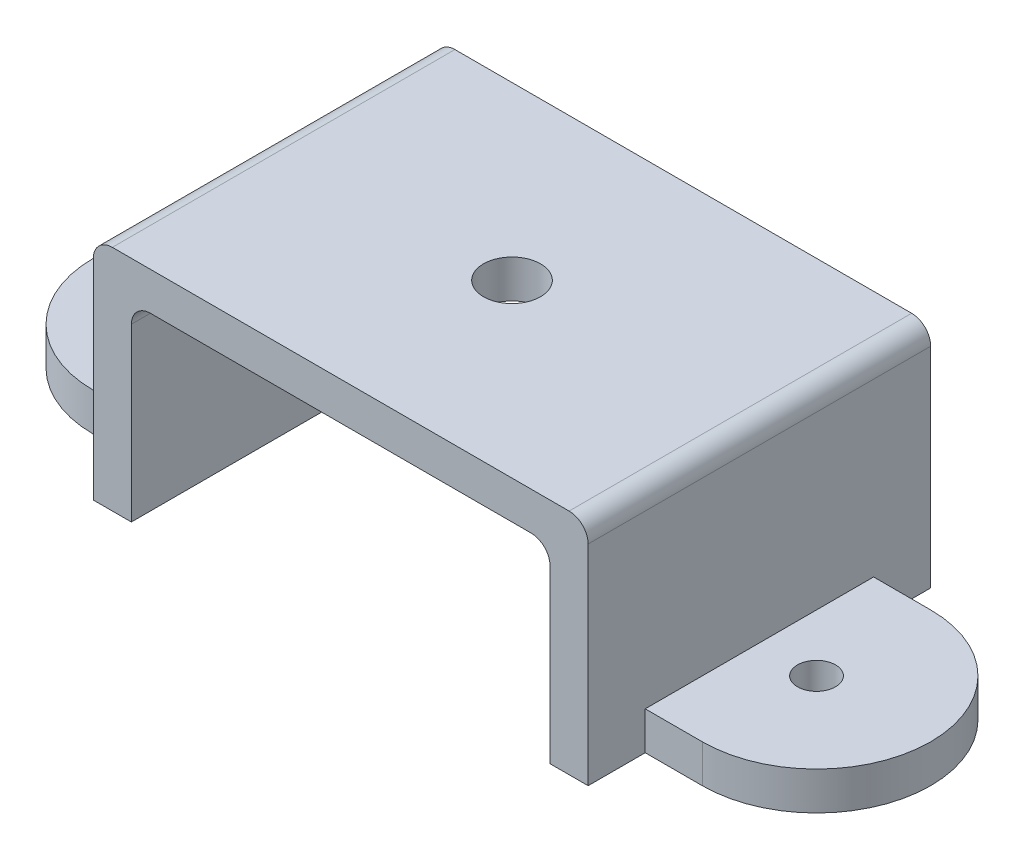
ISO-10303-21;
HEADER;
FILE_DESCRIPTION(('STEP AP214'),'2;1');
FILE_NAME('part.step','',(''),(''),'','','');
FILE_SCHEMA(('AUTOMOTIVE_DESIGN { 1 0 10303 214 1 1 1 1 }'));
ENDSEC;
DATA;
#1=APPLICATION_CONTEXT('core data for automotive mechanical design processes');
#2=APPLICATION_PROTOCOL_DEFINITION('international standard','automotive_design',2000,#1);
#3=PRODUCT_CONTEXT('',#1,'mechanical');
#4=PRODUCT('Part','Part','',(#3));
#5=PRODUCT_RELATED_PRODUCT_CATEGORY('part','',(#4));
#6=PRODUCT_DEFINITION_FORMATION('','',#4);
#7=PRODUCT_DEFINITION_CONTEXT('part definition',#1,'design');
#8=PRODUCT_DEFINITION('design','',#6,#7);
#9=PRODUCT_DEFINITION_SHAPE('','',#8);
#10=(LENGTH_UNIT() NAMED_UNIT(*) SI_UNIT(.MILLI.,.METRE.));
#11=(NAMED_UNIT(*) PLANE_ANGLE_UNIT() SI_UNIT($,.RADIAN.));
#12=(NAMED_UNIT(*) SI_UNIT($,.STERADIAN.) SOLID_ANGLE_UNIT());
#13=UNCERTAINTY_MEASURE_WITH_UNIT(LENGTH_MEASURE(1.E-05),#10,'distance_accuracy_value','');
#14=(GEOMETRIC_REPRESENTATION_CONTEXT(3) GLOBAL_UNCERTAINTY_ASSIGNED_CONTEXT((#13)) GLOBAL_UNIT_ASSIGNED_CONTEXT((#10,
#11,#12)) REPRESENTATION_CONTEXT('',''));
#15=CARTESIAN_POINT('',(0.,0.,0.));
#16=DIRECTION('',(0.,0.,1.));
#17=DIRECTION('',(1.,0.,0.));
#18=AXIS2_PLACEMENT_3D('',#15,#16,#17);
#19=CARTESIAN_POINT('',(0.,0.,0.));
#20=DIRECTION('',(0.,1.,0.));
#21=DIRECTION('',(0.,0.,1.));
#22=AXIS2_PLACEMENT_3D('',#19,#20,#21);
#23=PLANE('',#22);
#24=CARTESIAN_POINT('',(-101.6,0.,0.));
#25=DIRECTION('',(0.,1.,0.));
#26=DIRECTION('',(0.,0.,1.));
#27=AXIS2_PLACEMENT_3D('',#24,#25,#26);
#28=CIRCLE('',#27,6.35);
#29=CARTESIAN_POINT('',(-101.6,0.,6.35));
#30=VERTEX_POINT('',#29);
#31=EDGE_CURVE('E671',#30,#30,#28,.T.);
#32=ORIENTED_EDGE('',*,*,#31,.T.);
#33=EDGE_LOOP('',(#32));
#34=FACE_BOUND('',#33,.T.);
#35=DIRECTION('',(1.,0.,0.));
#36=VECTOR('',#35,1.);
#37=CARTESIAN_POINT('',(0.,0.,-57.15));
#38=LINE('',#37,#36);
#39=CARTESIAN_POINT('',(-82.55,0.,-57.15));
#40=VERTEX_POINT('',#39);
#41=CARTESIAN_POINT('',(-69.85,0.,-57.15));
#42=VERTEX_POINT('',#41);
#43=EDGE_CURVE('E231',#40,#42,#38,.T.);
#44=ORIENTED_EDGE('',*,*,#43,.T.);
#45=DIRECTION('',(0.,0.,1.));
#46=VECTOR('',#45,1.);
#47=CARTESIAN_POINT('',(-69.85,0.,-57.15));
#48=LINE('',#47,#46);
#49=CARTESIAN_POINT('',(-69.85,0.,57.15));
#50=VERTEX_POINT('',#49);
#51=EDGE_CURVE('E239',#42,#50,#48,.T.);
#52=ORIENTED_EDGE('',*,*,#51,.T.);
#53=DIRECTION('',(1.,0.,0.));
#54=VECTOR('',#53,1.);
#55=CARTESIAN_POINT('',(0.,0.,57.15));
#56=LINE('',#55,#54);
#57=CARTESIAN_POINT('',(-82.55,0.,57.15));
#58=VERTEX_POINT('',#57);
#59=EDGE_CURVE('E213',#58,#50,#56,.T.);
#60=ORIENTED_EDGE('',*,*,#59,.F.);
#61=DIRECTION('',(0.,0.,1.));
#62=VECTOR('',#61,1.);
#63=CARTESIAN_POINT('',(-82.55,0.,-57.15));
#64=LINE('',#63,#62);
#65=CARTESIAN_POINT('',(-82.55,0.,38.1));
#66=VERTEX_POINT('',#65);
#67=EDGE_CURVE('E244',#66,#58,#64,.T.);
#68=ORIENTED_EDGE('',*,*,#67,.F.);
#69=DIRECTION('',(1.,0.,0.));
#70=VECTOR('',#69,1.);
#71=CARTESIAN_POINT('',(0.,0.,38.0999999999999));
#72=LINE('',#71,#70);
#73=CARTESIAN_POINT('',(-101.6,0.,38.1));
#74=VERTEX_POINT('',#73);
#75=EDGE_CURVE('E278',#74,#66,#72,.T.);
#76=ORIENTED_EDGE('',*,*,#75,.F.);
#77=CARTESIAN_POINT('',(-101.6,0.,0.));
#78=DIRECTION('',(0.,1.,0.));
#79=DIRECTION('',(0.,0.,1.));
#80=AXIS2_PLACEMENT_3D('',#77,#78,#79);
#81=CIRCLE('',#80,38.1);
#82=CARTESIAN_POINT('',(-101.6,0.,-38.1));
#83=VERTEX_POINT('',#82);
#84=EDGE_CURVE('E288',#83,#74,#81,.T.);
#85=ORIENTED_EDGE('',*,*,#84,.F.);
#86=DIRECTION('',(1.,0.,0.));
#87=VECTOR('',#86,1.);
#88=CARTESIAN_POINT('',(0.,0.,-38.1));
#89=LINE('',#88,#87);
#90=CARTESIAN_POINT('',(-82.55,0.,-38.1));
#91=VERTEX_POINT('',#90);
#92=EDGE_CURVE('E285',#83,#91,#89,.T.);
#93=ORIENTED_EDGE('',*,*,#92,.T.);
#94=EDGE_CURVE('E242',#40,#91,#64,.T.);
#95=ORIENTED_EDGE('',*,*,#94,.F.);
#96=EDGE_LOOP('',(#44,#52,#60,#68,#76,#85,#93,#95));
#97=FACE_BOUND('',#96,.T.);
#98=ADVANCED_FACE('F35',(#34,#97),#23,.F.);
#99=CARTESIAN_POINT('',(101.6,0.,0.));
#100=DIRECTION('',(0.,1.,0.));
#101=DIRECTION('',(0.,0.,1.));
#102=AXIS2_PLACEMENT_3D('',#99,#100,#101);
#103=CIRCLE('',#102,6.35);
#104=CARTESIAN_POINT('',(101.6,0.,6.35));
#105=VERTEX_POINT('',#104);
#106=EDGE_CURVE('E663',#105,#105,#103,.T.);
#107=ORIENTED_EDGE('',*,*,#106,.T.);
#108=EDGE_LOOP('',(#107));
#109=FACE_BOUND('',#108,.T.);
#110=DIRECTION('',(0.,0.,1.));
#111=VECTOR('',#110,1.);
#112=CARTESIAN_POINT('',(69.85,0.,-57.15));
#113=LINE('',#112,#111);
#114=CARTESIAN_POINT('',(69.85,0.,-57.15));
#115=VERTEX_POINT('',#114);
#116=CARTESIAN_POINT('',(69.85,0.,57.15));
#117=VERTEX_POINT('',#116);
#118=EDGE_CURVE('E175',#115,#117,#113,.T.);
#119=ORIENTED_EDGE('',*,*,#118,.F.);
#120=DIRECTION('',(1.,0.,0.));
#121=VECTOR('',#120,1.);
#122=CARTESIAN_POINT('',(0.,0.,-57.15));
#123=LINE('',#122,#121);
#124=CARTESIAN_POINT('',(82.55,0.,-57.15));
#125=VERTEX_POINT('',#124);
#126=EDGE_CURVE('E222',#115,#125,#123,.T.);
#127=ORIENTED_EDGE('',*,*,#126,.T.);
#128=DIRECTION('',(0.,0.,1.));
#129=VECTOR('',#128,1.);
#130=CARTESIAN_POINT('',(82.55,0.,-57.15));
#131=LINE('',#130,#129);
#132=CARTESIAN_POINT('',(82.55,0.,-38.1));
#133=VERTEX_POINT('',#132);
#134=EDGE_CURVE('E245',#125,#133,#131,.T.);
#135=ORIENTED_EDGE('',*,*,#134,.T.);
#136=CARTESIAN_POINT('',(101.6,0.,-38.1));
#137=VERTEX_POINT('',#136);
#138=EDGE_CURVE('E284',#133,#137,#89,.T.);
#139=ORIENTED_EDGE('',*,*,#138,.T.);
#140=CARTESIAN_POINT('',(101.6,0.,0.));
#141=DIRECTION('',(0.,1.,0.));
#142=DIRECTION('',(0.,0.,1.));
#143=AXIS2_PLACEMENT_3D('',#140,#141,#142);
#144=CIRCLE('',#143,38.1);
#145=CARTESIAN_POINT('',(101.6,0.,38.0999999999999));
#146=VERTEX_POINT('',#145);
#147=EDGE_CURVE('E281',#146,#137,#144,.T.);
#148=ORIENTED_EDGE('',*,*,#147,.F.);
#149=CARTESIAN_POINT('',(82.55,0.,38.0999999999999));
#150=VERTEX_POINT('',#149);
#151=EDGE_CURVE('E263',#150,#146,#72,.T.);
#152=ORIENTED_EDGE('',*,*,#151,.F.);
#153=CARTESIAN_POINT('',(82.55,0.,57.15));
#154=VERTEX_POINT('',#153);
#155=EDGE_CURVE('E186',#150,#154,#131,.T.);
#156=ORIENTED_EDGE('',*,*,#155,.T.);
#157=DIRECTION('',(1.,0.,0.));
#158=VECTOR('',#157,1.);
#159=CARTESIAN_POINT('',(0.,0.,57.15));
#160=LINE('',#159,#158);
#161=EDGE_CURVE('E190',#117,#154,#160,.T.);
#162=ORIENTED_EDGE('',*,*,#161,.F.);
#163=EDGE_LOOP('',(#119,#127,#135,#139,#148,#152,#156,#162));
#164=FACE_BOUND('',#163,.T.);
#165=ADVANCED_FACE('F191',(#109,#164),#23,.F.);
#166=CARTESIAN_POINT('',(0.,63.5,-57.15));
#167=DIRECTION('',(0.,-1.,0.));
#168=DIRECTION('',(0.,0.,-1.));
#169=AXIS2_PLACEMENT_3D('',#166,#167,#168);
#170=PLANE('',#169);
#171=DIRECTION('',(1.,0.,0.));
#172=VECTOR('',#171,1.);
#173=CARTESIAN_POINT('',(0.,63.5,57.15));
#174=LINE('',#173,#172);
#175=CARTESIAN_POINT('',(-63.5,63.5,57.15));
#176=VERTEX_POINT('',#175);
#177=CARTESIAN_POINT('',(63.5,63.5,57.15));
#178=VERTEX_POINT('',#177);
#179=EDGE_CURVE('E219',#176,#178,#174,.T.);
#180=ORIENTED_EDGE('',*,*,#179,.F.);
#181=DIRECTION('',(0.,0.,1.));
#182=VECTOR('',#181,1.);
#183=CARTESIAN_POINT('',(-63.5,63.5,-57.15));
#184=LINE('',#183,#182);
#185=CARTESIAN_POINT('',(-63.5,63.5,-57.15));
#186=VERTEX_POINT('',#185);
#187=EDGE_CURVE('E306',#176,#186,#184,.F.);
#188=ORIENTED_EDGE('',*,*,#187,.T.);
#189=DIRECTION('',(1.,0.,0.));
#190=VECTOR('',#189,1.);
#191=CARTESIAN_POINT('',(0.,63.5,-57.15));
#192=LINE('',#191,#190);
#193=CARTESIAN_POINT('',(63.5,63.5,-57.15));
#194=VERTEX_POINT('',#193);
#195=EDGE_CURVE('E187',#186,#194,#192,.T.);
#196=ORIENTED_EDGE('',*,*,#195,.T.);
#197=DIRECTION('',(0.,0.,1.));
#198=VECTOR('',#197,1.);
#199=CARTESIAN_POINT('',(63.5,63.5,-57.15));
#200=LINE('',#199,#198);
#201=EDGE_CURVE('E303',#194,#178,#200,.T.);
#202=ORIENTED_EDGE('',*,*,#201,.T.);
#203=EDGE_LOOP('',(#180,#188,#196,#202));
#204=FACE_BOUND('',#203,.T.);
#205=CARTESIAN_POINT('',(0.,63.5,0.));
#206=DIRECTION('',(0.,-1.,0.));
#207=DIRECTION('',(0.,0.,-1.));
#208=AXIS2_PLACEMENT_3D('',#205,#206,#207);
#209=CIRCLE('',#208,9.525);
#210=CARTESIAN_POINT('',(0.,63.5,-9.525));
#211=VERTEX_POINT('',#210);
#212=EDGE_CURVE('E201',#211,#211,#209,.F.);
#213=ORIENTED_EDGE('',*,*,#212,.T.);
#214=EDGE_LOOP('',(#213));
#215=FACE_BOUND('',#214,.T.);
#216=ADVANCED_FACE('F344',(#204,#215),#170,.T.);
#217=CARTESIAN_POINT('',(0.,76.2,-57.15));
#218=DIRECTION('',(0.,-1.,0.));
#219=DIRECTION('',(0.,0.,-1.));
#220=AXIS2_PLACEMENT_3D('',#217,#218,#219);
#221=PLANE('',#220);
#222=DIRECTION('',(1.,0.,0.));
#223=VECTOR('',#222,1.);
#224=CARTESIAN_POINT('',(0.,76.2,57.15));
#225=LINE('',#224,#223);
#226=CARTESIAN_POINT('',(-76.2,76.2,57.15));
#227=VERTEX_POINT('',#226);
#228=CARTESIAN_POINT('',(76.2,76.2,57.15));
#229=VERTEX_POINT('',#228);
#230=EDGE_CURVE('E209',#227,#229,#225,.T.);
#231=ORIENTED_EDGE('',*,*,#230,.T.);
#232=DIRECTION('',(0.,0.,1.));
#233=VECTOR('',#232,1.);
#234=CARTESIAN_POINT('',(76.2,76.2,-57.15));
#235=LINE('',#234,#233);
#236=CARTESIAN_POINT('',(76.2,76.2,-57.15));
#237=VERTEX_POINT('',#236);
#238=EDGE_CURVE('E58',#229,#237,#235,.F.);
#239=ORIENTED_EDGE('',*,*,#238,.T.);
#240=DIRECTION('',(1.,0.,0.));
#241=VECTOR('',#240,1.);
#242=CARTESIAN_POINT('',(0.,76.2,-57.15));
#243=LINE('',#242,#241);
#244=CARTESIAN_POINT('',(-76.2,76.2,-57.15));
#245=VERTEX_POINT('',#244);
#246=EDGE_CURVE('E227',#245,#237,#243,.T.);
#247=ORIENTED_EDGE('',*,*,#246,.F.);
#248=DIRECTION('',(0.,0.,1.));
#249=VECTOR('',#248,1.);
#250=CARTESIAN_POINT('',(-76.2,76.2,-57.15));
#251=LINE('',#250,#249);
#252=EDGE_CURVE('E317',#245,#227,#251,.T.);
#253=ORIENTED_EDGE('',*,*,#252,.T.);
#254=EDGE_LOOP('',(#231,#239,#247,#253));
#255=FACE_BOUND('',#254,.T.);
#256=CARTESIAN_POINT('',(0.,76.2,0.));
#257=DIRECTION('',(0.,1.,0.));
#258=DIRECTION('',(0.,0.,1.));
#259=AXIS2_PLACEMENT_3D('',#256,#257,#258);
#260=CIRCLE('',#259,9.525);
#261=CARTESIAN_POINT('',(0.,76.2,-9.525));
#262=VERTEX_POINT('',#261);
#263=EDGE_CURVE('E204',#262,#262,#260,.T.);
#264=ORIENTED_EDGE('',*,*,#263,.F.);
#265=EDGE_LOOP('',(#264));
#266=FACE_BOUND('',#265,.T.);
#267=ADVANCED_FACE('F367',(#255,#266),#221,.F.);
#268=CARTESIAN_POINT('',(0.,12.7,38.0999999999999));
#269=DIRECTION('',(0.,0.,-1.));
#270=DIRECTION('',(-1.,0.,0.));
#271=AXIS2_PLACEMENT_3D('',#268,#269,#270);
#272=PLANE('',#271);
#273=DIRECTION('',(0.,-1.,0.));
#274=VECTOR('',#273,1.);
#275=CARTESIAN_POINT('',(-82.55,12.7,38.1));
#276=LINE('',#275,#274);
#277=CARTESIAN_POINT('',(-82.55,12.7,38.1));
#278=VERTEX_POINT('',#277);
#279=EDGE_CURVE('E261',#278,#66,#276,.T.);
#280=ORIENTED_EDGE('',*,*,#279,.F.);
#281=DIRECTION('',(1.,0.,0.));
#282=VECTOR('',#281,1.);
#283=CARTESIAN_POINT('',(0.,12.7,38.0999999999999));
#284=LINE('',#283,#282);
#285=CARTESIAN_POINT('',(-101.6,12.7,38.1));
#286=VERTEX_POINT('',#285);
#287=EDGE_CURVE('E264',#286,#278,#284,.T.);
#288=ORIENTED_EDGE('',*,*,#287,.F.);
#289=DIRECTION('',(0.,-1.,0.));
#290=VECTOR('',#289,1.);
#291=CARTESIAN_POINT('',(-101.6,12.7,38.1));
#292=LINE('',#291,#290);
#293=EDGE_CURVE('E277',#286,#74,#292,.T.);
#294=ORIENTED_EDGE('',*,*,#293,.T.);
#295=ORIENTED_EDGE('',*,*,#75,.T.);
#296=EDGE_LOOP('',(#280,#288,#294,#295));
#297=FACE_BOUND('',#296,.T.);
#298=ADVANCED_FACE('F392',(#297),#272,.F.);
#299=CARTESIAN_POINT('',(0.,12.7,-38.1));
#300=DIRECTION('',(0.,0.,-1.));
#301=DIRECTION('',(-1.,0.,0.));
#302=AXIS2_PLACEMENT_3D('',#299,#300,#301);
#303=PLANE('',#302);
#304=DIRECTION('',(1.,0.,0.));
#305=VECTOR('',#304,1.);
#306=CARTESIAN_POINT('',(0.,12.7,-38.1));
#307=LINE('',#306,#305);
#308=CARTESIAN_POINT('',(-101.6,12.7,-38.1));
#309=VERTEX_POINT('',#308);
#310=CARTESIAN_POINT('',(-82.55,12.7,-38.1));
#311=VERTEX_POINT('',#310);
#312=EDGE_CURVE('E272',#309,#311,#307,.T.);
#313=ORIENTED_EDGE('',*,*,#312,.T.);
#314=DIRECTION('',(0.,-1.,0.));
#315=VECTOR('',#314,1.);
#316=CARTESIAN_POINT('',(-82.55,12.7,-38.1));
#317=LINE('',#316,#315);
#318=EDGE_CURVE('E258',#311,#91,#317,.T.);
#319=ORIENTED_EDGE('',*,*,#318,.T.);
#320=ORIENTED_EDGE('',*,*,#92,.F.);
#321=DIRECTION('',(0.,-1.,0.));
#322=VECTOR('',#321,1.);
#323=CARTESIAN_POINT('',(-101.6,12.7,-38.1));
#324=LINE('',#323,#322);
#325=EDGE_CURVE('E292',#309,#83,#324,.T.);
#326=ORIENTED_EDGE('',*,*,#325,.F.);
#327=EDGE_LOOP('',(#313,#319,#320,#326));
#328=FACE_BOUND('',#327,.T.);
#329=ADVANCED_FACE('F383',(#328),#303,.T.);
#330=CARTESIAN_POINT('',(0.,12.7,0.));
#331=DIRECTION('',(0.,1.,0.));
#332=DIRECTION('',(0.,0.,1.));
#333=AXIS2_PLACEMENT_3D('',#330,#331,#332);
#334=PLANE('',#333);
#335=CARTESIAN_POINT('',(-101.6,12.7,0.));
#336=DIRECTION('',(0.,1.,0.));
#337=DIRECTION('',(0.,0.,1.));
#338=AXIS2_PLACEMENT_3D('',#335,#336,#337);
#339=CIRCLE('',#338,6.35);
#340=CARTESIAN_POINT('',(-101.6,12.7,6.35));
#341=VERTEX_POINT('',#340);
#342=EDGE_CURVE('E668',#341,#341,#339,.T.);
#343=ORIENTED_EDGE('',*,*,#342,.F.);
#344=EDGE_LOOP('',(#343));
#345=FACE_BOUND('',#344,.T.);
#346=ORIENTED_EDGE('',*,*,#287,.T.);
#347=DIRECTION('',(0.,0.,-1.));
#348=VECTOR('',#347,1.);
#349=CARTESIAN_POINT('',(-82.55,12.7,0.));
#350=LINE('',#349,#348);
#351=EDGE_CURVE('E255',#278,#311,#350,.T.);
#352=ORIENTED_EDGE('',*,*,#351,.T.);
#353=ORIENTED_EDGE('',*,*,#312,.F.);
#354=CARTESIAN_POINT('',(-101.6,12.7,0.));
#355=DIRECTION('',(0.,1.,0.));
#356=DIRECTION('',(0.,0.,1.));
#357=AXIS2_PLACEMENT_3D('',#354,#355,#356);
#358=CIRCLE('',#357,38.1);
#359=EDGE_CURVE('E275',#309,#286,#358,.T.);
#360=ORIENTED_EDGE('',*,*,#359,.T.);
#361=EDGE_LOOP('',(#346,#352,#353,#360));
#362=FACE_BOUND('',#361,.T.);
#363=ADVANCED_FACE('F394',(#345,#362),#334,.T.);
#364=CARTESIAN_POINT('',(82.55,12.7,38.0999999999999));
#365=VERTEX_POINT('',#364);
#366=CARTESIAN_POINT('',(101.6,12.7,38.0999999999999));
#367=VERTEX_POINT('',#366);
#368=EDGE_CURVE('E268',#365,#367,#284,.T.);
#369=ORIENTED_EDGE('',*,*,#368,.F.);
#370=DIRECTION('',(0.,-1.,0.));
#371=VECTOR('',#370,1.);
#372=CARTESIAN_POINT('',(82.55,12.7,38.0999999999999));
#373=LINE('',#372,#371);
#374=EDGE_CURVE('E253',#365,#150,#373,.T.);
#375=ORIENTED_EDGE('',*,*,#374,.T.);
#376=ORIENTED_EDGE('',*,*,#151,.T.);
#377=DIRECTION('',(0.,-1.,0.));
#378=VECTOR('',#377,1.);
#379=CARTESIAN_POINT('',(101.6,12.7,38.0999999999999));
#380=LINE('',#379,#378);
#381=EDGE_CURVE('E297',#367,#146,#380,.T.);
#382=ORIENTED_EDGE('',*,*,#381,.F.);
#383=EDGE_LOOP('',(#369,#375,#376,#382));
#384=FACE_BOUND('',#383,.T.);
#385=ADVANCED_FACE('F396',(#384),#272,.F.);
#386=CARTESIAN_POINT('',(101.6,12.7,0.));
#387=DIRECTION('',(0.,-1.,0.));
#388=DIRECTION('',(0.,0.,-1.));
#389=AXIS2_PLACEMENT_3D('',#386,#387,#388);
#390=CYLINDRICAL_SURFACE('',#389,38.1);
#391=ORIENTED_EDGE('',*,*,#147,.T.);
#392=DIRECTION('',(0.,-1.,0.));
#393=VECTOR('',#392,1.);
#394=CARTESIAN_POINT('',(101.6,12.7,-38.1));
#395=LINE('',#394,#393);
#396=CARTESIAN_POINT('',(101.6,12.7,-38.1));
#397=VERTEX_POINT('',#396);
#398=EDGE_CURVE('E294',#397,#137,#395,.T.);
#399=ORIENTED_EDGE('',*,*,#398,.F.);
#400=CARTESIAN_POINT('',(101.6,12.7,0.));
#401=DIRECTION('',(0.,1.,0.));
#402=DIRECTION('',(0.,0.,1.));
#403=AXIS2_PLACEMENT_3D('',#400,#401,#402);
#404=CIRCLE('',#403,38.1);
#405=EDGE_CURVE('E267',#367,#397,#404,.T.);
#406=ORIENTED_EDGE('',*,*,#405,.F.);
#407=ORIENTED_EDGE('',*,*,#381,.T.);
#408=EDGE_LOOP('',(#391,#399,#406,#407));
#409=FACE_BOUND('',#408,.T.);
#410=ADVANCED_FACE('F362',(#409),#390,.T.);
#411=DIRECTION('',(0.,-1.,0.));
#412=VECTOR('',#411,1.);
#413=CARTESIAN_POINT('',(82.55,12.7,-38.1));
#414=LINE('',#413,#412);
#415=CARTESIAN_POINT('',(82.55,12.7,-38.1));
#416=VERTEX_POINT('',#415);
#417=EDGE_CURVE('E250',#416,#133,#414,.T.);
#418=ORIENTED_EDGE('',*,*,#417,.F.);
#419=EDGE_CURVE('E271',#416,#397,#307,.T.);
#420=ORIENTED_EDGE('',*,*,#419,.T.);
#421=ORIENTED_EDGE('',*,*,#398,.T.);
#422=ORIENTED_EDGE('',*,*,#138,.F.);
#423=EDGE_LOOP('',(#418,#420,#421,#422));
#424=FACE_BOUND('',#423,.T.);
#425=ADVANCED_FACE('F358',(#424),#303,.T.);
#426=CARTESIAN_POINT('',(-101.6,12.7,0.));
#427=DIRECTION('',(0.,-1.,0.));
#428=DIRECTION('',(0.,0.,-1.));
#429=AXIS2_PLACEMENT_3D('',#426,#427,#428);
#430=CYLINDRICAL_SURFACE('',#429,38.1);
#431=ORIENTED_EDGE('',*,*,#84,.T.);
#432=ORIENTED_EDGE('',*,*,#293,.F.);
#433=ORIENTED_EDGE('',*,*,#359,.F.);
#434=ORIENTED_EDGE('',*,*,#325,.T.);
#435=EDGE_LOOP('',(#431,#432,#433,#434));
#436=FACE_BOUND('',#435,.T.);
#437=ADVANCED_FACE('F388',(#436),#430,.T.);
#438=CARTESIAN_POINT('',(101.6,12.7,0.));
#439=DIRECTION('',(0.,1.,0.));
#440=DIRECTION('',(0.,0.,1.));
#441=AXIS2_PLACEMENT_3D('',#438,#439,#440);
#442=CIRCLE('',#441,6.35);
#443=CARTESIAN_POINT('',(101.6,12.7,6.35));
#444=VERTEX_POINT('',#443);
#445=EDGE_CURVE('E665',#444,#444,#442,.T.);
#446=ORIENTED_EDGE('',*,*,#445,.F.);
#447=EDGE_LOOP('',(#446));
#448=FACE_BOUND('',#447,.T.);
#449=DIRECTION('',(0.,0.,-1.));
#450=VECTOR('',#449,1.);
#451=CARTESIAN_POINT('',(82.55,12.7,0.));
#452=LINE('',#451,#450);
#453=EDGE_CURVE('E241',#365,#416,#452,.T.);
#454=ORIENTED_EDGE('',*,*,#453,.F.);
#455=ORIENTED_EDGE('',*,*,#368,.T.);
#456=ORIENTED_EDGE('',*,*,#405,.T.);
#457=ORIENTED_EDGE('',*,*,#419,.F.);
#458=EDGE_LOOP('',(#454,#455,#456,#457));
#459=FACE_BOUND('',#458,.T.);
#460=ADVANCED_FACE('F399',(#448,#459),#334,.T.);
#461=CARTESIAN_POINT('',(69.85,0.,-57.15));
#462=DIRECTION('',(1.,0.,0.));
#463=DIRECTION('',(0.,0.,-1.));
#464=AXIS2_PLACEMENT_3D('',#461,#462,#463);
#465=PLANE('',#464);
#466=DIRECTION('',(0.,1.,0.));
#467=VECTOR('',#466,1.);
#468=CARTESIAN_POINT('',(69.85,0.,57.15));
#469=LINE('',#468,#467);
#470=CARTESIAN_POINT('',(69.85,57.15,57.15));
#471=VERTEX_POINT('',#470);
#472=EDGE_CURVE('E179',#117,#471,#469,.T.);
#473=ORIENTED_EDGE('',*,*,#472,.T.);
#474=DIRECTION('',(0.,0.,1.));
#475=VECTOR('',#474,1.);
#476=CARTESIAN_POINT('',(69.85,57.15,-57.15));
#477=LINE('',#476,#475);
#478=CARTESIAN_POINT('',(69.85,57.15,-57.15));
#479=VERTEX_POINT('',#478);
#480=EDGE_CURVE('E308',#471,#479,#477,.F.);
#481=ORIENTED_EDGE('',*,*,#480,.T.);
#482=DIRECTION('',(0.,1.,0.));
#483=VECTOR('',#482,1.);
#484=CARTESIAN_POINT('',(69.85,0.,-57.15));
#485=LINE('',#484,#483);
#486=EDGE_CURVE('E182',#115,#479,#485,.T.);
#487=ORIENTED_EDGE('',*,*,#486,.F.);
#488=ORIENTED_EDGE('',*,*,#118,.T.);
#489=EDGE_LOOP('',(#473,#481,#487,#488));
#490=FACE_BOUND('',#489,.T.);
#491=ADVANCED_FACE('F177',(#490),#465,.F.);
#492=CARTESIAN_POINT('',(-69.85,0.,-57.15));
#493=DIRECTION('',(1.,0.,0.));
#494=DIRECTION('',(0.,0.,-1.));
#495=AXIS2_PLACEMENT_3D('',#492,#493,#494);
#496=PLANE('',#495);
#497=DIRECTION('',(0.,1.,0.));
#498=VECTOR('',#497,1.);
#499=CARTESIAN_POINT('',(-69.85,0.,-57.15));
#500=LINE('',#499,#498);
#501=CARTESIAN_POINT('',(-69.85,57.15,-57.15));
#502=VERTEX_POINT('',#501);
#503=EDGE_CURVE('E234',#42,#502,#500,.T.);
#504=ORIENTED_EDGE('',*,*,#503,.T.);
#505=DIRECTION('',(0.,0.,1.));
#506=VECTOR('',#505,1.);
#507=CARTESIAN_POINT('',(-69.85,57.15,57.15));
#508=LINE('',#507,#506);
#509=CARTESIAN_POINT('',(-69.85,57.15,57.15));
#510=VERTEX_POINT('',#509);
#511=EDGE_CURVE('E300',#502,#510,#508,.T.);
#512=ORIENTED_EDGE('',*,*,#511,.T.);
#513=DIRECTION('',(0.,1.,0.));
#514=VECTOR('',#513,1.);
#515=CARTESIAN_POINT('',(-69.85,0.,57.15));
#516=LINE('',#515,#514);
#517=EDGE_CURVE('E216',#50,#510,#516,.T.);
#518=ORIENTED_EDGE('',*,*,#517,.F.);
#519=ORIENTED_EDGE('',*,*,#51,.F.);
#520=EDGE_LOOP('',(#504,#512,#518,#519));
#521=FACE_BOUND('',#520,.T.);
#522=ADVANCED_FACE('F339',(#521),#496,.T.);
#523=CARTESIAN_POINT('',(-82.55,0.,-57.15));
#524=DIRECTION('',(1.,0.,0.));
#525=DIRECTION('',(0.,0.,-1.));
#526=AXIS2_PLACEMENT_3D('',#523,#524,#525);
#527=PLANE('',#526);
#528=DIRECTION('',(0.,1.,0.));
#529=VECTOR('',#528,1.);
#530=CARTESIAN_POINT('',(-82.55,0.,57.15));
#531=LINE('',#530,#529);
#532=CARTESIAN_POINT('',(-82.55,69.85,57.15));
#533=VERTEX_POINT('',#532);
#534=EDGE_CURVE('E211',#58,#533,#531,.T.);
#535=ORIENTED_EDGE('',*,*,#534,.T.);
#536=DIRECTION('',(0.,0.,1.));
#537=VECTOR('',#536,1.);
#538=CARTESIAN_POINT('',(-82.55,69.85,-57.15));
#539=LINE('',#538,#537);
#540=CARTESIAN_POINT('',(-82.55,69.85,-57.15));
#541=VERTEX_POINT('',#540);
#542=EDGE_CURVE('E50',#533,#541,#539,.F.);
#543=ORIENTED_EDGE('',*,*,#542,.T.);
#544=DIRECTION('',(0.,1.,0.));
#545=VECTOR('',#544,1.);
#546=CARTESIAN_POINT('',(-82.55,0.,-57.15));
#547=LINE('',#546,#545);
#548=EDGE_CURVE('E229',#40,#541,#547,.T.);
#549=ORIENTED_EDGE('',*,*,#548,.F.);
#550=ORIENTED_EDGE('',*,*,#94,.T.);
#551=ORIENTED_EDGE('',*,*,#318,.F.);
#552=ORIENTED_EDGE('',*,*,#351,.F.);
#553=ORIENTED_EDGE('',*,*,#279,.T.);
#554=ORIENTED_EDGE('',*,*,#67,.T.);
#555=EDGE_LOOP('',(#535,#543,#549,#550,#551,#552,#553,#554));
#556=FACE_BOUND('',#555,.T.);
#557=ADVANCED_FACE('F375',(#556),#527,.F.);
#558=CARTESIAN_POINT('',(82.55,0.,-57.15));
#559=DIRECTION('',(1.,0.,0.));
#560=DIRECTION('',(0.,0.,-1.));
#561=AXIS2_PLACEMENT_3D('',#558,#559,#560);
#562=PLANE('',#561);
#563=DIRECTION('',(0.,1.,0.));
#564=VECTOR('',#563,1.);
#565=CARTESIAN_POINT('',(82.55,0.,-57.15));
#566=LINE('',#565,#564);
#567=CARTESIAN_POINT('',(82.55,69.85,-57.15));
#568=VERTEX_POINT('',#567);
#569=EDGE_CURVE('E224',#125,#568,#566,.T.);
#570=ORIENTED_EDGE('',*,*,#569,.T.);
#571=DIRECTION('',(0.,0.,1.));
#572=VECTOR('',#571,1.);
#573=CARTESIAN_POINT('',(82.55,69.85,57.15));
#574=LINE('',#573,#572);
#575=CARTESIAN_POINT('',(82.55,69.85,57.15));
#576=VERTEX_POINT('',#575);
#577=EDGE_CURVE('E310',#568,#576,#574,.T.);
#578=ORIENTED_EDGE('',*,*,#577,.T.);
#579=DIRECTION('',(0.,1.,0.));
#580=VECTOR('',#579,1.);
#581=CARTESIAN_POINT('',(82.55,0.,57.15));
#582=LINE('',#581,#580);
#583=EDGE_CURVE('E197',#154,#576,#582,.T.);
#584=ORIENTED_EDGE('',*,*,#583,.F.);
#585=ORIENTED_EDGE('',*,*,#155,.F.);
#586=ORIENTED_EDGE('',*,*,#374,.F.);
#587=ORIENTED_EDGE('',*,*,#453,.T.);
#588=ORIENTED_EDGE('',*,*,#417,.T.);
#589=ORIENTED_EDGE('',*,*,#134,.F.);
#590=EDGE_LOOP('',(#570,#578,#584,#585,#586,#587,#588,#589));
#591=FACE_BOUND('',#590,.T.);
#592=ADVANCED_FACE('F353',(#591),#562,.T.);
#593=CARTESIAN_POINT('',(0.,0.,-57.15));
#594=DIRECTION('',(0.,0.,1.));
#595=DIRECTION('',(1.,0.,0.));
#596=AXIS2_PLACEMENT_3D('',#593,#594,#595);
#597=PLANE('',#596);
#598=ORIENTED_EDGE('',*,*,#246,.T.);
#599=CARTESIAN_POINT('',(76.2,69.85,-57.15));
#600=DIRECTION('',(0.,0.,1.));
#601=DIRECTION('',(1.,0.,0.));
#602=AXIS2_PLACEMENT_3D('',#599,#600,#601);
#603=CIRCLE('',#602,6.35);
#604=EDGE_CURVE('E323',#237,#568,#603,.F.);
#605=ORIENTED_EDGE('',*,*,#604,.T.);
#606=ORIENTED_EDGE('',*,*,#569,.F.);
#607=ORIENTED_EDGE('',*,*,#126,.F.);
#608=ORIENTED_EDGE('',*,*,#486,.T.);
#609=CARTESIAN_POINT('',(63.5,57.15,-57.15));
#610=DIRECTION('',(0.,0.,1.));
#611=DIRECTION('',(1.,0.,0.));
#612=AXIS2_PLACEMENT_3D('',#609,#610,#611);
#613=CIRCLE('',#612,6.35);
#614=EDGE_CURVE('E11',#479,#194,#613,.T.);
#615=ORIENTED_EDGE('',*,*,#614,.T.);
#616=ORIENTED_EDGE('',*,*,#195,.F.);
#617=CARTESIAN_POINT('',(-63.5,57.15,-57.15));
#618=DIRECTION('',(0.,0.,1.));
#619=DIRECTION('',(1.,0.,0.));
#620=AXIS2_PLACEMENT_3D('',#617,#618,#619);
#621=CIRCLE('',#620,6.35);
#622=EDGE_CURVE('E328',#186,#502,#621,.T.);
#623=ORIENTED_EDGE('',*,*,#622,.T.);
#624=ORIENTED_EDGE('',*,*,#503,.F.);
#625=ORIENTED_EDGE('',*,*,#43,.F.);
#626=ORIENTED_EDGE('',*,*,#548,.T.);
#627=CARTESIAN_POINT('',(-76.2,69.85,-57.15));
#628=DIRECTION('',(0.,0.,1.));
#629=DIRECTION('',(1.,0.,0.));
#630=AXIS2_PLACEMENT_3D('',#627,#628,#629);
#631=CIRCLE('',#630,6.35);
#632=EDGE_CURVE('E321',#541,#245,#631,.F.);
#633=ORIENTED_EDGE('',*,*,#632,.T.);
#634=EDGE_LOOP('',(#598,#605,#606,#607,#608,#615,#616,#623,#624,#625,#626,#633));
#635=FACE_BOUND('',#634,.T.);
#636=ADVANCED_FACE('F333',(#635),#597,.F.);
#637=CARTESIAN_POINT('',(0.,0.,57.15));
#638=DIRECTION('',(0.,0.,1.));
#639=DIRECTION('',(1.,0.,0.));
#640=AXIS2_PLACEMENT_3D('',#637,#638,#639);
#641=PLANE('',#640);
#642=ORIENTED_EDGE('',*,*,#583,.T.);
#643=CARTESIAN_POINT('',(76.2,69.85,57.15));
#644=DIRECTION('',(0.,0.,1.));
#645=DIRECTION('',(1.,0.,0.));
#646=AXIS2_PLACEMENT_3D('',#643,#644,#645);
#647=CIRCLE('',#646,6.35);
#648=EDGE_CURVE('E315',#576,#229,#647,.T.);
#649=ORIENTED_EDGE('',*,*,#648,.T.);
#650=ORIENTED_EDGE('',*,*,#230,.F.);
#651=CARTESIAN_POINT('',(-76.2,69.85,57.15));
#652=DIRECTION('',(0.,0.,1.));
#653=DIRECTION('',(1.,0.,0.));
#654=AXIS2_PLACEMENT_3D('',#651,#652,#653);
#655=CIRCLE('',#654,6.35);
#656=EDGE_CURVE('E313',#227,#533,#655,.T.);
#657=ORIENTED_EDGE('',*,*,#656,.T.);
#658=ORIENTED_EDGE('',*,*,#534,.F.);
#659=ORIENTED_EDGE('',*,*,#59,.T.);
#660=ORIENTED_EDGE('',*,*,#517,.T.);
#661=CARTESIAN_POINT('',(-63.5,57.15,57.15));
#662=DIRECTION('',(0.,0.,1.));
#663=DIRECTION('',(1.,0.,0.));
#664=AXIS2_PLACEMENT_3D('',#661,#662,#663);
#665=CIRCLE('',#664,6.35);
#666=EDGE_CURVE('E326',#510,#176,#665,.F.);
#667=ORIENTED_EDGE('',*,*,#666,.T.);
#668=ORIENTED_EDGE('',*,*,#179,.T.);
#669=CARTESIAN_POINT('',(63.5,57.15,57.15));
#670=DIRECTION('',(0.,0.,1.));
#671=DIRECTION('',(1.,0.,0.));
#672=AXIS2_PLACEMENT_3D('',#669,#670,#671);
#673=CIRCLE('',#672,6.35);
#674=EDGE_CURVE('E43',#178,#471,#673,.F.);
#675=ORIENTED_EDGE('',*,*,#674,.T.);
#676=ORIENTED_EDGE('',*,*,#472,.F.);
#677=ORIENTED_EDGE('',*,*,#161,.T.);
#678=EDGE_LOOP('',(#642,#649,#650,#657,#658,#659,#660,#667,#668,#675,#676,#677));
#679=FACE_BOUND('',#678,.T.);
#680=ADVANCED_FACE('F199',(#679),#641,.T.);
#681=CARTESIAN_POINT('',(0.,76.2,0.));
#682=DIRECTION('',(0.,-1.,0.));
#683=DIRECTION('',(0.,0.,-1.));
#684=AXIS2_PLACEMENT_3D('',#681,#682,#683);
#685=CYLINDRICAL_SURFACE('',#684,9.525);
#686=CARTESIAN_POINT('',(0.,63.5,-9.525));
#687=CARTESIAN_POINT('',(0.,63.6322916666667,-9.525));
#688=CARTESIAN_POINT('',(0.,63.7645833333333,-9.525));
#689=CARTESIAN_POINT('',(0.,64.0291666666667,-9.525));
#690=CARTESIAN_POINT('',(0.,64.1614583333333,-9.525));
#691=CARTESIAN_POINT('',(0.,64.4260416666667,-9.525));
#692=CARTESIAN_POINT('',(0.,64.5583333333333,-9.525));
#693=CARTESIAN_POINT('',(0.,64.8229166666667,-9.525));
#694=CARTESIAN_POINT('',(0.,64.9552083333333,-9.525));
#695=CARTESIAN_POINT('',(0.,65.2197916666667,-9.525));
#696=CARTESIAN_POINT('',(0.,65.3520833333333,-9.525));
#697=CARTESIAN_POINT('',(0.,65.6166666666667,-9.525));
#698=CARTESIAN_POINT('',(0.,65.7489583333333,-9.525));
#699=CARTESIAN_POINT('',(0.,66.0135416666667,-9.525));
#700=CARTESIAN_POINT('',(0.,66.1458333333333,-9.525));
#701=CARTESIAN_POINT('',(0.,66.4104166666667,-9.525));
#702=CARTESIAN_POINT('',(0.,66.5427083333333,-9.525));
#703=CARTESIAN_POINT('',(0.,66.8072916666667,-9.525));
#704=CARTESIAN_POINT('',(0.,66.9395833333333,-9.525));
#705=CARTESIAN_POINT('',(0.,67.2041666666667,-9.525));
#706=CARTESIAN_POINT('',(0.,67.3364583333333,-9.525));
#707=CARTESIAN_POINT('',(0.,67.6010416666667,-9.525));
#708=CARTESIAN_POINT('',(0.,67.7333333333333,-9.525));
#709=CARTESIAN_POINT('',(0.,67.9979166666667,-9.525));
#710=CARTESIAN_POINT('',(0.,68.1302083333333,-9.525));
#711=CARTESIAN_POINT('',(0.,68.3947916666667,-9.525));
#712=CARTESIAN_POINT('',(0.,68.5270833333333,-9.525));
#713=CARTESIAN_POINT('',(0.,68.7916666666667,-9.525));
#714=CARTESIAN_POINT('',(0.,68.9239583333333,-9.525));
#715=CARTESIAN_POINT('',(0.,69.1885416666667,-9.525));
#716=CARTESIAN_POINT('',(0.,69.3208333333333,-9.525));
#717=CARTESIAN_POINT('',(0.,69.5854166666667,-9.525));
#718=CARTESIAN_POINT('',(0.,69.7177083333333,-9.525));
#719=CARTESIAN_POINT('',(0.,69.9822916666667,-9.525));
#720=CARTESIAN_POINT('',(0.,70.1145833333333,-9.525));
#721=CARTESIAN_POINT('',(0.,70.3791666666667,-9.525));
#722=CARTESIAN_POINT('',(0.,70.5114583333333,-9.525));
#723=CARTESIAN_POINT('',(0.,70.7760416666667,-9.525));
#724=CARTESIAN_POINT('',(0.,70.9083333333333,-9.525));
#725=CARTESIAN_POINT('',(0.,71.1729166666667,-9.525));
#726=CARTESIAN_POINT('',(0.,71.3052083333333,-9.525));
#727=CARTESIAN_POINT('',(0.,71.5697916666667,-9.525));
#728=CARTESIAN_POINT('',(0.,71.7020833333333,-9.525));
#729=CARTESIAN_POINT('',(0.,71.9666666666667,-9.525));
#730=CARTESIAN_POINT('',(0.,72.0989583333333,-9.525));
#731=CARTESIAN_POINT('',(0.,72.3635416666667,-9.525));
#732=CARTESIAN_POINT('',(0.,72.4958333333333,-9.525));
#733=CARTESIAN_POINT('',(0.,72.7604166666667,-9.525));
#734=CARTESIAN_POINT('',(0.,72.8927083333333,-9.525));
#735=CARTESIAN_POINT('',(0.,73.1572916666667,-9.525));
#736=CARTESIAN_POINT('',(0.,73.2895833333333,-9.525));
#737=CARTESIAN_POINT('',(0.,73.5541666666667,-9.525));
#738=CARTESIAN_POINT('',(0.,73.6864583333333,-9.525));
#739=CARTESIAN_POINT('',(0.,73.9510416666667,-9.525));
#740=CARTESIAN_POINT('',(0.,74.0833333333333,-9.525));
#741=CARTESIAN_POINT('',(0.,74.3479166666667,-9.525));
#742=CARTESIAN_POINT('',(0.,74.4802083333333,-9.525));
#743=CARTESIAN_POINT('',(0.,74.7447916666667,-9.525));
#744=CARTESIAN_POINT('',(0.,74.8770833333333,-9.525));
#745=CARTESIAN_POINT('',(0.,75.1416666666667,-9.525));
#746=CARTESIAN_POINT('',(0.,75.2739583333333,-9.525));
#747=CARTESIAN_POINT('',(0.,75.5385416666667,-9.525));
#748=CARTESIAN_POINT('',(0.,75.6708333333333,-9.525));
#749=CARTESIAN_POINT('',(0.,75.9354166666667,-9.525));
#750=CARTESIAN_POINT('',(0.,76.0677083333333,-9.525));
#751=CARTESIAN_POINT('',(0.,76.2,-9.525));
#752=B_SPLINE_CURVE_WITH_KNOTS('',3,(#686,#687,#688,#689,#690,#691,#692,#693,#694,#695,#696,
#697,#698,#699,#700,#701,#702,#703,#704,#705,#706,#707,#708,#709,#710,#711,#712,#713,#714,#715,
#716,#717,#718,#719,#720,#721,#722,#723,#724,#725,#726,#727,#728,#729,#730,#731,#732,#733,#734,
#735,#736,#737,#738,#739,#740,#741,#742,#743,#744,#745,#746,#747,#748,#749,#750,#751),
.UNSPECIFIED.,.F.,.F.,(4,2,2,2,2,2,2,2,2,2,2,2,2,2,2,2,2,2,2,2,2,2,2,2,2,2,2,2,2,2,2,2,4),(0.,
0.396874999999991,0.793749999999996,1.19062499999999,1.58749999999999,1.984375,2.38124999999999,
2.77812499999999,3.175,3.57187499999999,3.96874999999999,4.365625,4.76249999999999,
5.15937499999999,5.55624999999998,5.95312499999999,6.34999999999999,6.74687499999999,
7.14374999999999,7.54062499999998,7.93749999999999,8.33437499999999,8.73124999999998,
9.12812499999999,9.52499999999999,9.92187499999998,10.31875,10.715625,11.1125,11.509375,
11.90625,12.303125,12.7),.UNSPECIFIED.);
#753=EDGE_CURVE('BSEAM426',#211,#262,#752,.T.);
#754=ORIENTED_EDGE('',*,*,#212,.F.);
#755=ORIENTED_EDGE('',*,*,#263,.T.);
#756=ORIENTED_EDGE('',*,*,#753,.T.);
#757=ORIENTED_EDGE('',*,*,#753,.F.);
#758=EDGE_LOOP('',(#754,#756,#755,#757));
#759=FACE_BOUND('',#758,.T.);
#760=ADVANCED_FACE('F426',(#759),#685,.F.);
#761=CARTESIAN_POINT('',(-63.5,57.15,-57.15));
#762=DIRECTION('',(0.,0.,-1.));
#763=DIRECTION('',(-1.,0.,0.));
#764=AXIS2_PLACEMENT_3D('',#761,#762,#763);
#765=CYLINDRICAL_SURFACE('',#764,6.35);
#766=ORIENTED_EDGE('',*,*,#622,.F.);
#767=ORIENTED_EDGE('',*,*,#187,.F.);
#768=ORIENTED_EDGE('',*,*,#666,.F.);
#769=ORIENTED_EDGE('',*,*,#511,.F.);
#770=EDGE_LOOP('',(#766,#767,#768,#769));
#771=FACE_BOUND('',#770,.T.);
#772=ADVANCED_FACE('F341',(#771),#765,.F.);
#773=CARTESIAN_POINT('',(63.5,57.15,-57.15));
#774=DIRECTION('',(0.,0.,1.));
#775=DIRECTION('',(1.,0.,0.));
#776=AXIS2_PLACEMENT_3D('',#773,#774,#775);
#777=CYLINDRICAL_SURFACE('',#776,6.35);
#778=ORIENTED_EDGE('',*,*,#614,.F.);
#779=ORIENTED_EDGE('',*,*,#480,.F.);
#780=ORIENTED_EDGE('',*,*,#674,.F.);
#781=ORIENTED_EDGE('',*,*,#201,.F.);
#782=EDGE_LOOP('',(#778,#779,#780,#781));
#783=FACE_BOUND('',#782,.T.);
#784=ADVANCED_FACE('F349',(#783),#777,.F.);
#785=CARTESIAN_POINT('',(76.2,69.85,-57.15));
#786=DIRECTION('',(0.,0.,-1.));
#787=DIRECTION('',(-1.,0.,0.));
#788=AXIS2_PLACEMENT_3D('',#785,#786,#787);
#789=CYLINDRICAL_SURFACE('',#788,6.35);
#790=ORIENTED_EDGE('',*,*,#604,.F.);
#791=ORIENTED_EDGE('',*,*,#238,.F.);
#792=ORIENTED_EDGE('',*,*,#648,.F.);
#793=ORIENTED_EDGE('',*,*,#577,.F.);
#794=EDGE_LOOP('',(#790,#791,#792,#793));
#795=FACE_BOUND('',#794,.T.);
#796=ADVANCED_FACE('F371',(#795),#789,.T.);
#797=CARTESIAN_POINT('',(-76.2,69.85,-57.15));
#798=DIRECTION('',(0.,0.,1.));
#799=DIRECTION('',(1.,0.,0.));
#800=AXIS2_PLACEMENT_3D('',#797,#798,#799);
#801=CYLINDRICAL_SURFACE('',#800,6.35);
#802=ORIENTED_EDGE('',*,*,#632,.F.);
#803=ORIENTED_EDGE('',*,*,#542,.F.);
#804=ORIENTED_EDGE('',*,*,#656,.F.);
#805=ORIENTED_EDGE('',*,*,#252,.F.);
#806=EDGE_LOOP('',(#802,#803,#804,#805));
#807=FACE_BOUND('',#806,.T.);
#808=ADVANCED_FACE('F37',(#807),#801,.T.);
#809=CARTESIAN_POINT('',(101.6,0.,0.));
#810=DIRECTION('',(0.,1.,0.));
#811=DIRECTION('',(0.,0.,1.));
#812=AXIS2_PLACEMENT_3D('',#809,#810,#811);
#813=CYLINDRICAL_SURFACE('',#812,6.35);
#814=ORIENTED_EDGE('',*,*,#106,.F.);
#815=EDGE_LOOP('',(#814));
#816=FACE_BOUND('',#815,.T.);
#817=ORIENTED_EDGE('',*,*,#445,.T.);
#818=EDGE_LOOP('',(#817));
#819=FACE_BOUND('',#818,.T.);
#820=ADVANCED_FACE('F432',(#816,#819),#813,.F.);
#821=CARTESIAN_POINT('',(-101.6,0.,0.));
#822=DIRECTION('',(0.,1.,0.));
#823=DIRECTION('',(0.,0.,1.));
#824=AXIS2_PLACEMENT_3D('',#821,#822,#823);
#825=CYLINDRICAL_SURFACE('',#824,6.35);
#826=ORIENTED_EDGE('',*,*,#31,.F.);
#827=EDGE_LOOP('',(#826));
#828=FACE_BOUND('',#827,.T.);
#829=ORIENTED_EDGE('',*,*,#342,.T.);
#830=EDGE_LOOP('',(#829));
#831=FACE_BOUND('',#830,.T.);
#832=ADVANCED_FACE('F436',(#828,#831),#825,.F.);
#833=CLOSED_SHELL('',(#98,#165,#216,#267,#298,#329,#363,#385,#410,#425,#437,#460,#491,#522,#557,
#592,#636,#680,#760,#772,#784,#796,#808,#820,#832));
#834=MANIFOLD_SOLID_BREP('B2',#833);
#835=ADVANCED_BREP_SHAPE_REPRESENTATION('',(#18,#834),#14);
#836=SHAPE_DEFINITION_REPRESENTATION(#9,#835);
ENDSEC;
END-ISO-10303-21;
